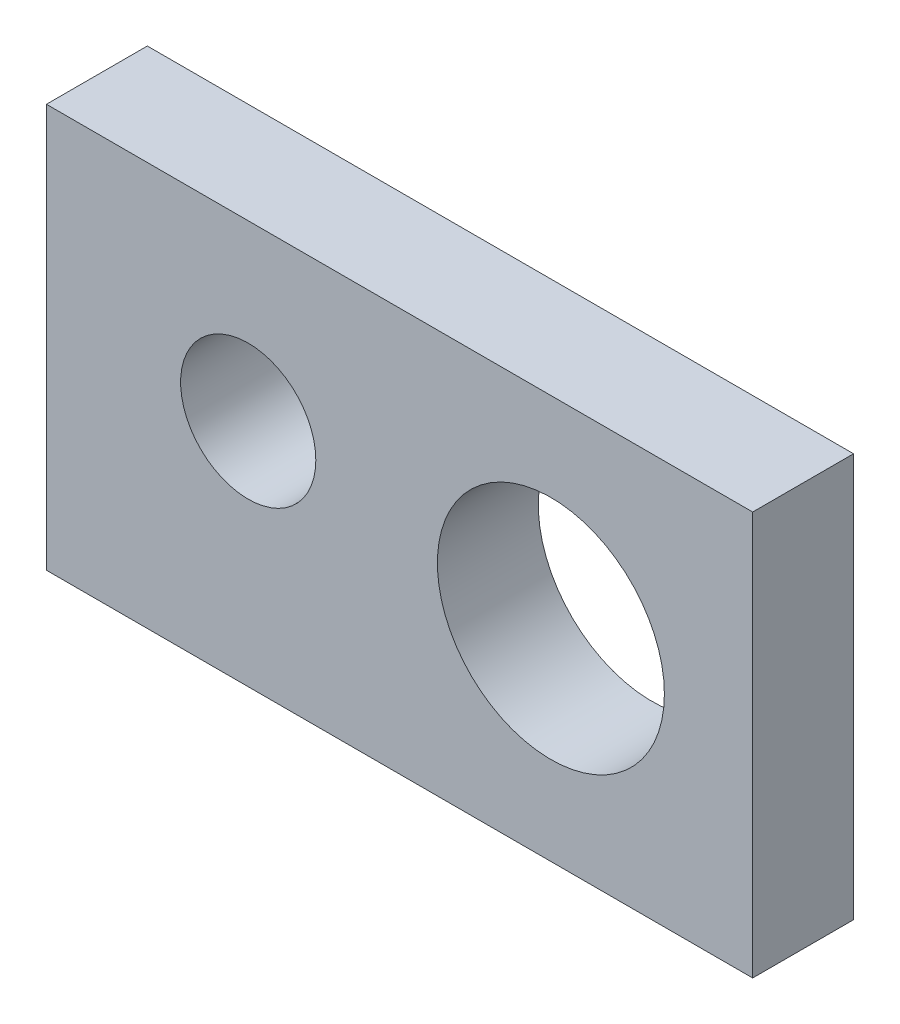
ISO-10303-21;
HEADER;
FILE_DESCRIPTION(('STEP AP214'),'2;1');
FILE_NAME('part.step','',(''),(''),'','','');
FILE_SCHEMA(('AUTOMOTIVE_DESIGN { 1 0 10303 214 1 1 1 1 }'));
ENDSEC;
DATA;
#1=APPLICATION_CONTEXT('core data for automotive mechanical design processes');
#2=APPLICATION_PROTOCOL_DEFINITION('international standard','automotive_design',2000,#1);
#3=PRODUCT_CONTEXT('',#1,'mechanical');
#4=PRODUCT('Part','Part','',(#3));
#5=PRODUCT_RELATED_PRODUCT_CATEGORY('part','',(#4));
#6=PRODUCT_DEFINITION_FORMATION('','',#4);
#7=PRODUCT_DEFINITION_CONTEXT('part definition',#1,'design');
#8=PRODUCT_DEFINITION('design','',#6,#7);
#9=PRODUCT_DEFINITION_SHAPE('','',#8);
#10=(LENGTH_UNIT() NAMED_UNIT(*) SI_UNIT(.MILLI.,.METRE.));
#11=(NAMED_UNIT(*) PLANE_ANGLE_UNIT() SI_UNIT($,.RADIAN.));
#12=(NAMED_UNIT(*) SI_UNIT($,.STERADIAN.) SOLID_ANGLE_UNIT());
#13=UNCERTAINTY_MEASURE_WITH_UNIT(LENGTH_MEASURE(1.E-05),#10,'distance_accuracy_value','');
#14=(GEOMETRIC_REPRESENTATION_CONTEXT(3) GLOBAL_UNCERTAINTY_ASSIGNED_CONTEXT((#13)) GLOBAL_UNIT_ASSIGNED_CONTEXT((#10,
#11,#12)) REPRESENTATION_CONTEXT('',''));
#15=CARTESIAN_POINT('',(0.,0.,0.));
#16=DIRECTION('',(0.,0.,1.));
#17=DIRECTION('',(1.,0.,0.));
#18=AXIS2_PLACEMENT_3D('',#15,#16,#17);
#19=CARTESIAN_POINT('',(0.,0.,12.7));
#20=DIRECTION('',(1.,0.,0.));
#21=DIRECTION('',(0.,0.,-1.));
#22=AXIS2_PLACEMENT_3D('',#19,#20,#21);
#23=PLANE('',#22);
#24=DIRECTION('',(0.,-1.,0.));
#25=VECTOR('',#24,1.);
#26=CARTESIAN_POINT('',(0.,0.,0.));
#27=LINE('',#26,#25);
#28=CARTESIAN_POINT('',(0.,50.8,0.));
#29=VERTEX_POINT('',#28);
#30=CARTESIAN_POINT('',(0.,0.,0.));
#31=VERTEX_POINT('',#30);
#32=EDGE_CURVE('E98',#29,#31,#27,.T.);
#33=ORIENTED_EDGE('',*,*,#32,.T.);
#34=DIRECTION('',(0.,0.,-1.));
#35=VECTOR('',#34,1.);
#36=CARTESIAN_POINT('',(0.,0.,12.7));
#37=LINE('',#36,#35);
#38=CARTESIAN_POINT('',(0.,0.,12.7));
#39=VERTEX_POINT('',#38);
#40=EDGE_CURVE('E11',#39,#31,#37,.T.);
#41=ORIENTED_EDGE('',*,*,#40,.F.);
#42=DIRECTION('',(0.,-1.,0.));
#43=VECTOR('',#42,1.);
#44=CARTESIAN_POINT('',(0.,0.,12.7));
#45=LINE('',#44,#43);
#46=CARTESIAN_POINT('',(0.,50.8,12.7));
#47=VERTEX_POINT('',#46);
#48=EDGE_CURVE('E86',#47,#39,#45,.T.);
#49=ORIENTED_EDGE('',*,*,#48,.F.);
#50=DIRECTION('',(0.,0.,-1.));
#51=VECTOR('',#50,1.);
#52=CARTESIAN_POINT('',(0.,50.8,12.7));
#53=LINE('',#52,#51);
#54=EDGE_CURVE('E94',#47,#29,#53,.T.);
#55=ORIENTED_EDGE('',*,*,#54,.T.);
#56=EDGE_LOOP('',(#33,#41,#49,#55));
#57=FACE_BOUND('',#56,.T.);
#58=ADVANCED_FACE('F35',(#57),#23,.F.);
#59=CARTESIAN_POINT('',(0.,0.,12.7));
#60=DIRECTION('',(0.,1.,0.));
#61=DIRECTION('',(0.,0.,1.));
#62=AXIS2_PLACEMENT_3D('',#59,#60,#61);
#63=PLANE('',#62);
#64=DIRECTION('',(1.,0.,0.));
#65=VECTOR('',#64,1.);
#66=CARTESIAN_POINT('',(0.,0.,0.));
#67=LINE('',#66,#65);
#68=CARTESIAN_POINT('',(88.9,0.,0.));
#69=VERTEX_POINT('',#68);
#70=EDGE_CURVE('E90',#31,#69,#67,.T.);
#71=ORIENTED_EDGE('',*,*,#70,.T.);
#72=DIRECTION('',(0.,0.,-1.));
#73=VECTOR('',#72,1.);
#74=CARTESIAN_POINT('',(88.9,0.,12.7));
#75=LINE('',#74,#73);
#76=CARTESIAN_POINT('',(88.9,0.,12.7));
#77=VERTEX_POINT('',#76);
#78=EDGE_CURVE('E43',#77,#69,#75,.T.);
#79=ORIENTED_EDGE('',*,*,#78,.F.);
#80=DIRECTION('',(1.,0.,0.));
#81=VECTOR('',#80,1.);
#82=CARTESIAN_POINT('',(0.,0.,12.7));
#83=LINE('',#82,#81);
#84=EDGE_CURVE('E81',#39,#77,#83,.T.);
#85=ORIENTED_EDGE('',*,*,#84,.F.);
#86=ORIENTED_EDGE('',*,*,#40,.T.);
#87=EDGE_LOOP('',(#71,#79,#85,#86));
#88=FACE_BOUND('',#87,.T.);
#89=ADVANCED_FACE('F89',(#88),#63,.F.);
#90=CARTESIAN_POINT('',(88.9,0.,12.7));
#91=DIRECTION('',(-1.,0.,0.));
#92=DIRECTION('',(0.,0.,1.));
#93=AXIS2_PLACEMENT_3D('',#90,#91,#92);
#94=PLANE('',#93);
#95=DIRECTION('',(0.,1.,0.));
#96=VECTOR('',#95,1.);
#97=CARTESIAN_POINT('',(88.9,0.,0.));
#98=LINE('',#97,#96);
#99=CARTESIAN_POINT('',(88.9,50.8,0.));
#100=VERTEX_POINT('',#99);
#101=EDGE_CURVE('E68',#69,#100,#98,.T.);
#102=ORIENTED_EDGE('',*,*,#101,.T.);
#103=DIRECTION('',(0.,0.,-1.));
#104=VECTOR('',#103,1.);
#105=CARTESIAN_POINT('',(88.9,50.8,12.7));
#106=LINE('',#105,#104);
#107=CARTESIAN_POINT('',(88.9,50.8,12.7));
#108=VERTEX_POINT('',#107);
#109=EDGE_CURVE('E91',#108,#100,#106,.T.);
#110=ORIENTED_EDGE('',*,*,#109,.F.);
#111=DIRECTION('',(0.,1.,0.));
#112=VECTOR('',#111,1.);
#113=CARTESIAN_POINT('',(88.9,0.,12.7));
#114=LINE('',#113,#112);
#115=EDGE_CURVE('E84',#77,#108,#114,.T.);
#116=ORIENTED_EDGE('',*,*,#115,.F.);
#117=ORIENTED_EDGE('',*,*,#78,.T.);
#118=EDGE_LOOP('',(#102,#110,#116,#117));
#119=FACE_BOUND('',#118,.T.);
#120=ADVANCED_FACE('F92',(#119),#94,.F.);
#121=CARTESIAN_POINT('',(0.,50.8,12.7));
#122=DIRECTION('',(0.,-1.,0.));
#123=DIRECTION('',(0.,0.,-1.));
#124=AXIS2_PLACEMENT_3D('',#121,#122,#123);
#125=PLANE('',#124);
#126=DIRECTION('',(-1.,0.,0.));
#127=VECTOR('',#126,1.);
#128=CARTESIAN_POINT('',(0.,50.8,0.));
#129=LINE('',#128,#127);
#130=EDGE_CURVE('E74',#100,#29,#129,.T.);
#131=ORIENTED_EDGE('',*,*,#130,.T.);
#132=ORIENTED_EDGE('',*,*,#54,.F.);
#133=DIRECTION('',(-1.,0.,0.));
#134=VECTOR('',#133,1.);
#135=CARTESIAN_POINT('',(0.,50.8,12.7));
#136=LINE('',#135,#134);
#137=EDGE_CURVE('E51',#108,#47,#136,.T.);
#138=ORIENTED_EDGE('',*,*,#137,.F.);
#139=ORIENTED_EDGE('',*,*,#109,.T.);
#140=EDGE_LOOP('',(#131,#132,#138,#139));
#141=FACE_BOUND('',#140,.T.);
#142=ADVANCED_FACE('F106',(#141),#125,.F.);
#143=CARTESIAN_POINT('',(0.,0.,12.7));
#144=DIRECTION('',(0.,0.,-1.));
#145=DIRECTION('',(-1.,0.,0.));
#146=AXIS2_PLACEMENT_3D('',#143,#144,#145);
#147=PLANE('',#146);
#148=CARTESIAN_POINT('',(25.4,28.956,12.7));
#149=DIRECTION('',(0.,0.,1.));
#150=DIRECTION('',(1.,0.,0.));
#151=AXIS2_PLACEMENT_3D('',#148,#149,#150);
#152=CIRCLE('',#151,8.509);
#153=CARTESIAN_POINT('',(33.909,28.956,12.7));
#154=VERTEX_POINT('',#153);
#155=EDGE_CURVE('E118',#154,#154,#152,.T.);
#156=ORIENTED_EDGE('',*,*,#155,.F.);
#157=EDGE_LOOP('',(#156));
#158=FACE_BOUND('',#157,.T.);
#159=CARTESIAN_POINT('',(63.5,25.4,12.7));
#160=DIRECTION('',(0.,0.,1.));
#161=DIRECTION('',(1.,0.,0.));
#162=AXIS2_PLACEMENT_3D('',#159,#160,#161);
#163=CIRCLE('',#162,14.2875);
#164=CARTESIAN_POINT('',(77.7875,25.4,12.7));
#165=VERTEX_POINT('',#164);
#166=EDGE_CURVE('E112',#165,#165,#163,.T.);
#167=ORIENTED_EDGE('',*,*,#166,.F.);
#168=EDGE_LOOP('',(#167));
#169=FACE_BOUND('',#168,.T.);
#170=ORIENTED_EDGE('',*,*,#48,.T.);
#171=ORIENTED_EDGE('',*,*,#84,.T.);
#172=ORIENTED_EDGE('',*,*,#115,.T.);
#173=ORIENTED_EDGE('',*,*,#137,.T.);
#174=EDGE_LOOP('',(#170,#171,#172,#173));
#175=FACE_BOUND('',#174,.T.);
#176=ADVANCED_FACE('F82',(#158,#169,#175),#147,.F.);
#177=CARTESIAN_POINT('',(0.,0.,0.));
#178=DIRECTION('',(0.,0.,-1.));
#179=DIRECTION('',(-1.,0.,0.));
#180=AXIS2_PLACEMENT_3D('',#177,#178,#179);
#181=PLANE('',#180);
#182=CARTESIAN_POINT('',(25.4,28.956,0.));
#183=DIRECTION('',(0.,0.,1.));
#184=DIRECTION('',(1.,0.,0.));
#185=AXIS2_PLACEMENT_3D('',#182,#183,#184);
#186=CIRCLE('',#185,8.509);
#187=CARTESIAN_POINT('',(33.909,28.956,0.));
#188=VERTEX_POINT('',#187);
#189=EDGE_CURVE('E115',#188,#188,#186,.T.);
#190=ORIENTED_EDGE('',*,*,#189,.T.);
#191=EDGE_LOOP('',(#190));
#192=FACE_BOUND('',#191,.T.);
#193=CARTESIAN_POINT('',(63.5,25.4,0.));
#194=DIRECTION('',(0.,0.,1.));
#195=DIRECTION('',(1.,0.,0.));
#196=AXIS2_PLACEMENT_3D('',#193,#194,#195);
#197=CIRCLE('',#196,14.2875);
#198=CARTESIAN_POINT('',(77.7875,25.4,0.));
#199=VERTEX_POINT('',#198);
#200=EDGE_CURVE('E101',#199,#199,#197,.T.);
#201=ORIENTED_EDGE('',*,*,#200,.T.);
#202=EDGE_LOOP('',(#201));
#203=FACE_BOUND('',#202,.T.);
#204=ORIENTED_EDGE('',*,*,#32,.F.);
#205=ORIENTED_EDGE('',*,*,#130,.F.);
#206=ORIENTED_EDGE('',*,*,#101,.F.);
#207=ORIENTED_EDGE('',*,*,#70,.F.);
#208=EDGE_LOOP('',(#204,#205,#206,#207));
#209=FACE_BOUND('',#208,.T.);
#210=ADVANCED_FACE('F109',(#192,#203,#209),#181,.T.);
#211=CARTESIAN_POINT('',(63.5,25.4,0.));
#212=DIRECTION('',(0.,0.,1.));
#213=DIRECTION('',(1.,0.,0.));
#214=AXIS2_PLACEMENT_3D('',#211,#212,#213);
#215=CYLINDRICAL_SURFACE('',#214,14.2875);
#216=ORIENTED_EDGE('',*,*,#200,.F.);
#217=EDGE_LOOP('',(#216));
#218=FACE_BOUND('',#217,.T.);
#219=ORIENTED_EDGE('',*,*,#166,.T.);
#220=EDGE_LOOP('',(#219));
#221=FACE_BOUND('',#220,.T.);
#222=ADVANCED_FACE('F129',(#218,#221),#215,.F.);
#223=CARTESIAN_POINT('',(25.4,28.956,0.));
#224=DIRECTION('',(0.,0.,1.));
#225=DIRECTION('',(1.,0.,0.));
#226=AXIS2_PLACEMENT_3D('',#223,#224,#225);
#227=CYLINDRICAL_SURFACE('',#226,8.509);
#228=ORIENTED_EDGE('',*,*,#189,.F.);
#229=EDGE_LOOP('',(#228));
#230=FACE_BOUND('',#229,.T.);
#231=ORIENTED_EDGE('',*,*,#155,.T.);
#232=EDGE_LOOP('',(#231));
#233=FACE_BOUND('',#232,.T.);
#234=ADVANCED_FACE('F126',(#230,#233),#227,.F.);
#235=CLOSED_SHELL('',(#58,#89,#120,#142,#176,#210,#222,#234));
#236=MANIFOLD_SOLID_BREP('B2',#235);
#237=ADVANCED_BREP_SHAPE_REPRESENTATION('',(#18,#236),#14);
#238=SHAPE_DEFINITION_REPRESENTATION(#9,#237);
ENDSEC;
END-ISO-10303-21;
